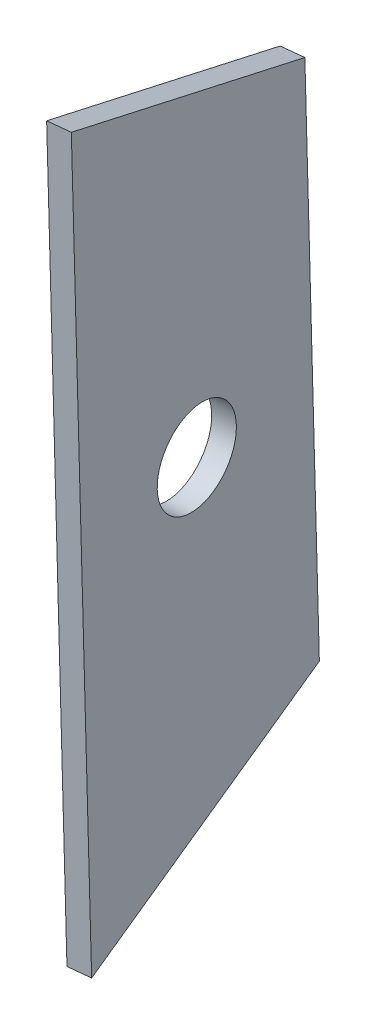
ISO-10303-21;
HEADER;
FILE_DESCRIPTION(('STEP AP214'),'2;1');
FILE_NAME('part.step','',(''),(''),'','','');
FILE_SCHEMA(('AUTOMOTIVE_DESIGN { 1 0 10303 214 1 1 1 1 }'));
ENDSEC;
DATA;
#1=APPLICATION_CONTEXT('core data for automotive mechanical design processes');
#2=APPLICATION_PROTOCOL_DEFINITION('international standard','automotive_design',2000,#1);
#3=PRODUCT_CONTEXT('',#1,'mechanical');
#4=PRODUCT('Part','Part','',(#3));
#5=PRODUCT_RELATED_PRODUCT_CATEGORY('part','',(#4));
#6=PRODUCT_DEFINITION_FORMATION('','',#4);
#7=PRODUCT_DEFINITION_CONTEXT('part definition',#1,'design');
#8=PRODUCT_DEFINITION('design','',#6,#7);
#9=PRODUCT_DEFINITION_SHAPE('','',#8);
#10=(LENGTH_UNIT() NAMED_UNIT(*) SI_UNIT(.MILLI.,.METRE.));
#11=(NAMED_UNIT(*) PLANE_ANGLE_UNIT() SI_UNIT($,.RADIAN.));
#12=(NAMED_UNIT(*) SI_UNIT($,.STERADIAN.) SOLID_ANGLE_UNIT());
#13=UNCERTAINTY_MEASURE_WITH_UNIT(LENGTH_MEASURE(1.E-05),#10,'distance_accuracy_value','');
#14=(GEOMETRIC_REPRESENTATION_CONTEXT(3) GLOBAL_UNCERTAINTY_ASSIGNED_CONTEXT((#13)) GLOBAL_UNIT_ASSIGNED_CONTEXT((#10,
#11,#12)) REPRESENTATION_CONTEXT('',''));
#15=CARTESIAN_POINT('',(0.,0.,0.));
#16=DIRECTION('',(0.,0.,1.));
#17=DIRECTION('',(1.,0.,0.));
#18=AXIS2_PLACEMENT_3D('',#15,#16,#17);
#19=CARTESIAN_POINT('',(370.512256551213,-5.4068391837589,-45.7818425322992));
#20=DIRECTION('',(0.992348265819815,-0.0144812145690196,-0.122618162394537));
#21=DIRECTION('',(-0.122631021273155,0.,-0.992452332669687));
#22=AXIS2_PLACEMENT_3D('',#19,#20,#21);
#23=PLANE('',#22);
#24=DIRECTION('',(0.121183243952927,0.30449081036797,0.944775088466299));
#25=VECTOR('',#24,1.);
#26=CARTESIAN_POINT('',(321.167649949654,234.670040470819,-473.480631780285));
#27=LINE('',#26,#25);
#28=CARTESIAN_POINT('',(321.167649949654,234.670040470819,-473.480631780285));
#29=VERTEX_POINT('',#28);
#30=CARTESIAN_POINT('',(323.631737078167,240.861423554024,-454.269987974336));
#31=VERTEX_POINT('',#30);
#32=EDGE_CURVE('E91',#29,#31,#27,.T.);
#33=ORIENTED_EDGE('',*,*,#32,.T.);
#34=DIRECTION('',(-0.0204012325191497,-0.998678846054045,-0.0471630380261933));
#35=VECTOR('',#34,1.);
#36=CARTESIAN_POINT('',(323.631737078167,240.861423554024,-454.269987974336));
#37=LINE('',#36,#35);
#38=CARTESIAN_POINT('',(322.52120693739,186.49887666093,-456.837282632123));
#39=VERTEX_POINT('',#38);
#40=EDGE_CURVE('E86',#31,#39,#37,.T.);
#41=ORIENTED_EDGE('',*,*,#40,.T.);
#42=DIRECTION('',(-0.103064134245971,0.449709982714248,-0.887208383458632));
#43=VECTOR('',#42,1.);
#44=CARTESIAN_POINT('',(322.52120693739,186.49887666093,-456.837282632123));
#45=LINE('',#44,#43);
#46=CARTESIAN_POINT('',(320.374911952246,195.864018935986,-475.31326283733));
#47=VERTEX_POINT('',#46);
#48=EDGE_CURVE('E89',#39,#47,#45,.T.);
#49=ORIENTED_EDGE('',*,*,#48,.T.);
#50=DIRECTION('',(0.0204012325191497,0.998678846054045,0.0471630380261924));
#51=VECTOR('',#50,1.);
#52=CARTESIAN_POINT('',(320.374911952246,195.864018935986,-475.31326283733));
#53=LINE('',#52,#51);
#54=EDGE_CURVE('E56',#47,#29,#53,.T.);
#55=ORIENTED_EDGE('',*,*,#54,.T.);
#56=EDGE_LOOP('',(#33,#41,#49,#55));
#57=FACE_BOUND('',#56,.T.);
#58=CARTESIAN_POINT('',(321.923876479364,214.47358990544,-464.975291306018));
#59=DIRECTION('',(0.992348265819815,-0.0144812145690195,-0.122618162394535));
#60=DIRECTION('',(-0.122631021273154,0.,-0.992452332669687));
#61=AXIS2_PLACEMENT_3D('',#58,#59,#60);
#62=CIRCLE('',#61,3.26389999999999);
#63=CARTESIAN_POINT('',(321.523621089031,214.47358990544,-468.214556474619));
#64=VERTEX_POINT('',#63);
#65=EDGE_CURVE('E106',#64,#64,#62,.T.);
#66=ORIENTED_EDGE('',*,*,#65,.F.);
#67=EDGE_LOOP('',(#66));
#68=FACE_BOUND('',#67,.T.);
#69=ADVANCED_FACE('F39',(#57,#68),#23,.T.);
#70=CARTESIAN_POINT('',(368.936903679224,-5.38385025563058,-45.5871861994979));
#71=DIRECTION('',(0.992348265819815,-0.0144812145690196,-0.122618162394537));
#72=DIRECTION('',(-0.122631021273155,0.,-0.992452332669687));
#73=AXIS2_PLACEMENT_3D('',#70,#71,#72);
#74=PLANE('',#73);
#75=DIRECTION('',(0.121183243952927,0.30449081036797,0.944775088466299));
#76=VECTOR('',#75,1.);
#77=CARTESIAN_POINT('',(319.592297077665,234.693029398947,-473.285975447483));
#78=LINE('',#77,#76);
#79=CARTESIAN_POINT('',(319.592297077665,234.693029398947,-473.285975447483));
#80=VERTEX_POINT('',#79);
#81=CARTESIAN_POINT('',(322.056384206178,240.884412482152,-454.075331641534));
#82=VERTEX_POINT('',#81);
#83=EDGE_CURVE('E103',#80,#82,#78,.T.);
#84=ORIENTED_EDGE('',*,*,#83,.F.);
#85=DIRECTION('',(0.0204012325191497,0.998678846054045,0.0471630380261924));
#86=VECTOR('',#85,1.);
#87=CARTESIAN_POINT('',(318.799559080257,195.887007864114,-475.118606504528));
#88=LINE('',#87,#86);
#89=CARTESIAN_POINT('',(318.799559080257,195.887007864114,-475.118606504528));
#90=VERTEX_POINT('',#89);
#91=EDGE_CURVE('E79',#90,#80,#88,.T.);
#92=ORIENTED_EDGE('',*,*,#91,.F.);
#93=DIRECTION('',(-0.103064134245971,0.449709982714248,-0.887208383458632));
#94=VECTOR('',#93,1.);
#95=CARTESIAN_POINT('',(320.945854065401,186.521865589058,-456.642626299322));
#96=LINE('',#95,#94);
#97=CARTESIAN_POINT('',(320.945854065401,186.521865589058,-456.642626299322));
#98=VERTEX_POINT('',#97);
#99=EDGE_CURVE('E73',#98,#90,#96,.T.);
#100=ORIENTED_EDGE('',*,*,#99,.F.);
#101=DIRECTION('',(-0.0204012325191497,-0.998678846054045,-0.0471630380261933));
#102=VECTOR('',#101,1.);
#103=CARTESIAN_POINT('',(322.056384206178,240.884412482152,-454.075331641534));
#104=LINE('',#103,#102);
#105=EDGE_CURVE('E95',#82,#98,#104,.T.);
#106=ORIENTED_EDGE('',*,*,#105,.F.);
#107=EDGE_LOOP('',(#84,#92,#100,#106));
#108=FACE_BOUND('',#107,.T.);
#109=CARTESIAN_POINT('',(320.348523607375,214.496578833568,-464.780634973217));
#110=DIRECTION('',(0.992348265819815,-0.0144812145690195,-0.122618162394535));
#111=DIRECTION('',(-0.122631021273154,0.,-0.992452332669687));
#112=AXIS2_PLACEMENT_3D('',#109,#110,#111);
#113=CIRCLE('',#112,3.26389999999999);
#114=CARTESIAN_POINT('',(319.948268217042,214.496578833568,-468.019900141817));
#115=VERTEX_POINT('',#114);
#116=EDGE_CURVE('E118',#115,#115,#113,.T.);
#117=ORIENTED_EDGE('',*,*,#116,.T.);
#118=EDGE_LOOP('',(#117));
#119=FACE_BOUND('',#118,.T.);
#120=ADVANCED_FACE('F114',(#108,#119),#74,.F.);
#121=CARTESIAN_POINT('',(321.167649949654,234.670040470819,-473.480631780285));
#122=DIRECTION('',(0.0236546128577986,-0.95240518731581,0.303915808184577));
#123=DIRECTION('',(0.,-0.304000870516583,-0.952671753924278));
#124=AXIS2_PLACEMENT_3D('',#121,#122,#123);
#125=PLANE('',#124);
#126=ORIENTED_EDGE('',*,*,#83,.T.);
#127=DIRECTION('',(-0.992348265819815,0.0144812145690195,0.122618162394535));
#128=VECTOR('',#127,1.);
#129=CARTESIAN_POINT('',(323.631737078167,240.861423554024,-454.269987974336));
#130=LINE('',#129,#128);
#131=EDGE_CURVE('E11',#31,#82,#130,.T.);
#132=ORIENTED_EDGE('',*,*,#131,.F.);
#133=ORIENTED_EDGE('',*,*,#32,.F.);
#134=DIRECTION('',(-0.992348265819815,0.0144812145690195,0.122618162394535));
#135=VECTOR('',#134,1.);
#136=CARTESIAN_POINT('',(321.167649949654,234.670040470819,-473.480631780285));
#137=LINE('',#136,#135);
#138=EDGE_CURVE('E99',#29,#80,#137,.T.);
#139=ORIENTED_EDGE('',*,*,#138,.T.);
#140=EDGE_LOOP('',(#126,#132,#133,#139));
#141=FACE_BOUND('',#140,.T.);
#142=ADVANCED_FACE('F41',(#141),#125,.F.);
#143=CARTESIAN_POINT('',(323.631737078167,240.861423554024,-454.269987974336));
#144=DIRECTION('',(-0.121773186852058,0.0493037206381687,-0.991332655618248));
#145=DIRECTION('',(-0.992539750668632,0.,0.121921463830815));
#146=AXIS2_PLACEMENT_3D('',#143,#144,#145);
#147=PLANE('',#146);
#148=ORIENTED_EDGE('',*,*,#105,.T.);
#149=DIRECTION('',(-0.992348265819815,0.0144812145690195,0.122618162394535));
#150=VECTOR('',#149,1.);
#151=CARTESIAN_POINT('',(322.52120693739,186.49887666093,-456.837282632123));
#152=LINE('',#151,#150);
#153=EDGE_CURVE('E48',#39,#98,#152,.T.);
#154=ORIENTED_EDGE('',*,*,#153,.F.);
#155=ORIENTED_EDGE('',*,*,#40,.F.);
#156=ORIENTED_EDGE('',*,*,#131,.T.);
#157=EDGE_LOOP('',(#148,#154,#155,#156));
#158=FACE_BOUND('',#157,.T.);
#159=ADVANCED_FACE('F94',(#158),#147,.F.);
#160=CARTESIAN_POINT('',(322.52120693739,186.49887666093,-456.837282632123));
#161=DIRECTION('',(0.0679904666591968,0.893057235495999,0.444776427625956));
#162=DIRECTION('',(0.,-0.445808040423996,0.895128589138631));
#163=AXIS2_PLACEMENT_3D('',#160,#161,#162);
#164=PLANE('',#163);
#165=ORIENTED_EDGE('',*,*,#99,.T.);
#166=DIRECTION('',(-0.992348265819815,0.0144812145690195,0.122618162394535));
#167=VECTOR('',#166,1.);
#168=CARTESIAN_POINT('',(320.374911952246,195.864018935986,-475.31326283733));
#169=LINE('',#168,#167);
#170=EDGE_CURVE('E96',#47,#90,#169,.T.);
#171=ORIENTED_EDGE('',*,*,#170,.F.);
#172=ORIENTED_EDGE('',*,*,#48,.F.);
#173=ORIENTED_EDGE('',*,*,#153,.T.);
#174=EDGE_LOOP('',(#165,#171,#172,#173));
#175=FACE_BOUND('',#174,.T.);
#176=ADVANCED_FACE('F97',(#175),#164,.F.);
#177=CARTESIAN_POINT('',(320.374911952246,195.864018935986,-475.31326283733));
#178=DIRECTION('',(0.121773186852058,-0.0493037206381678,0.991332655618248));
#179=DIRECTION('',(0.992539750668633,0.,-0.121921463830816));
#180=AXIS2_PLACEMENT_3D('',#177,#178,#179);
#181=PLANE('',#180);
#182=ORIENTED_EDGE('',*,*,#91,.T.);
#183=ORIENTED_EDGE('',*,*,#138,.F.);
#184=ORIENTED_EDGE('',*,*,#54,.F.);
#185=ORIENTED_EDGE('',*,*,#170,.T.);
#186=EDGE_LOOP('',(#182,#183,#184,#185));
#187=FACE_BOUND('',#186,.T.);
#188=ADVANCED_FACE('F111',(#187),#181,.F.);
#189=CARTESIAN_POINT('',(321.923876479364,214.47358990544,-464.975291306018));
#190=DIRECTION('',(-0.992348265819815,0.0144812145690195,0.122618162394535));
#191=DIRECTION('',(0.122631021273154,0.,0.992452332669687));
#192=AXIS2_PLACEMENT_3D('',#189,#190,#191);
#193=CYLINDRICAL_SURFACE('',#192,3.26389999999999);
#194=ORIENTED_EDGE('',*,*,#65,.T.);
#195=EDGE_LOOP('',(#194));
#196=FACE_BOUND('',#195,.T.);
#197=ORIENTED_EDGE('',*,*,#116,.F.);
#198=EDGE_LOOP('',(#197));
#199=FACE_BOUND('',#198,.T.);
#200=ADVANCED_FACE('F124',(#196,#199),#193,.F.);
#201=CLOSED_SHELL('',(#69,#120,#142,#159,#176,#188,#200));
#202=MANIFOLD_SOLID_BREP('B2',#201);
#203=ADVANCED_BREP_SHAPE_REPRESENTATION('',(#18,#202),#14);
#204=SHAPE_DEFINITION_REPRESENTATION(#9,#203);
ENDSEC;
END-ISO-10303-21;
